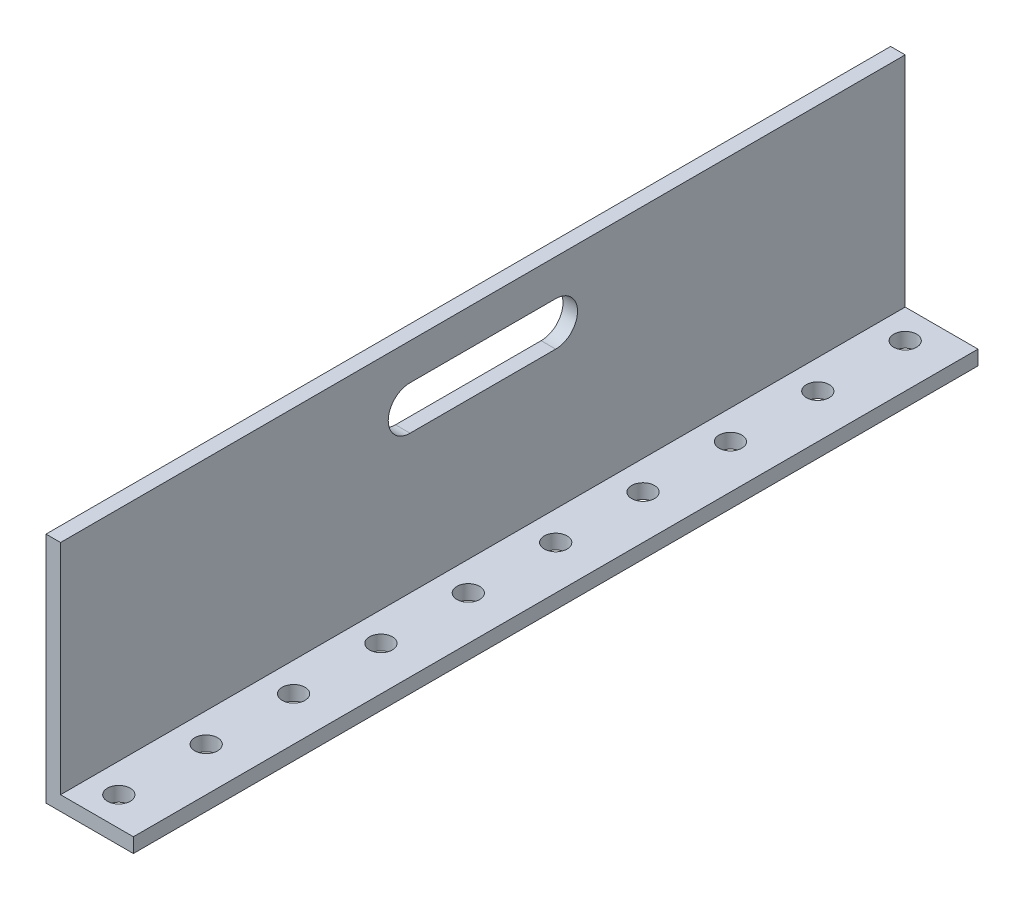
ISO-10303-21;
HEADER;
FILE_DESCRIPTION(('STEP AP214'),'2;1');
FILE_NAME('part.step','',(''),(''),'','','');
FILE_SCHEMA(('AUTOMOTIVE_DESIGN { 1 0 10303 214 1 1 1 1 }'));
ENDSEC;
DATA;
#1=APPLICATION_CONTEXT('core data for automotive mechanical design processes');
#2=APPLICATION_PROTOCOL_DEFINITION('international standard','automotive_design',2000,#1);
#3=PRODUCT_CONTEXT('',#1,'mechanical');
#4=PRODUCT('Part','Part','',(#3));
#5=PRODUCT_RELATED_PRODUCT_CATEGORY('part','',(#4));
#6=PRODUCT_DEFINITION_FORMATION('','',#4);
#7=PRODUCT_DEFINITION_CONTEXT('part definition',#1,'design');
#8=PRODUCT_DEFINITION('design','',#6,#7);
#9=PRODUCT_DEFINITION_SHAPE('','',#8);
#10=(LENGTH_UNIT() NAMED_UNIT(*) SI_UNIT(.MILLI.,.METRE.));
#11=(NAMED_UNIT(*) PLANE_ANGLE_UNIT() SI_UNIT($,.RADIAN.));
#12=(NAMED_UNIT(*) SI_UNIT($,.STERADIAN.) SOLID_ANGLE_UNIT());
#13=UNCERTAINTY_MEASURE_WITH_UNIT(LENGTH_MEASURE(1.E-05),#10,'distance_accuracy_value','');
#14=(GEOMETRIC_REPRESENTATION_CONTEXT(3) GLOBAL_UNCERTAINTY_ASSIGNED_CONTEXT((#13)) GLOBAL_UNIT_ASSIGNED_CONTEXT((#10,
#11,#12)) REPRESENTATION_CONTEXT('',''));
#15=CARTESIAN_POINT('',(0.,0.,0.));
#16=DIRECTION('',(0.,0.,1.));
#17=DIRECTION('',(1.,0.,0.));
#18=AXIS2_PLACEMENT_3D('',#15,#16,#17);
#19=CARTESIAN_POINT('',(0.,0.,184.15));
#20=DIRECTION('',(-1.,0.,0.));
#21=DIRECTION('',(0.,0.,1.));
#22=AXIS2_PLACEMENT_3D('',#19,#20,#21);
#23=PLANE('',#22);
#24=CARTESIAN_POINT('',(0.,38.1,76.2));
#25=DIRECTION('',(-1.,0.,0.));
#26=DIRECTION('',(0.,0.,1.));
#27=AXIS2_PLACEMENT_3D('',#24,#25,#26);
#28=CIRCLE('',#27,4.7625);
#29=CARTESIAN_POINT('',(0.,42.8625,76.2));
#30=VERTEX_POINT('',#29);
#31=CARTESIAN_POINT('',(0.,33.3375,76.2));
#32=VERTEX_POINT('',#31);
#33=EDGE_CURVE('E64',#30,#32,#28,.T.);
#34=ORIENTED_EDGE('',*,*,#33,.F.);
#35=DIRECTION('',(0.,0.,-1.));
#36=VECTOR('',#35,1.);
#37=CARTESIAN_POINT('',(0.,42.8625,76.2));
#38=LINE('',#37,#36);
#39=CARTESIAN_POINT('',(0.,42.8625,107.95));
#40=VERTEX_POINT('',#39);
#41=EDGE_CURVE('E146',#40,#30,#38,.T.);
#42=ORIENTED_EDGE('',*,*,#41,.F.);
#43=CARTESIAN_POINT('',(0.,38.1,107.95));
#44=DIRECTION('',(-1.,0.,0.));
#45=DIRECTION('',(0.,0.,1.));
#46=AXIS2_PLACEMENT_3D('',#43,#44,#45);
#47=CIRCLE('',#46,4.7625);
#48=CARTESIAN_POINT('',(0.,33.3375,107.95));
#49=VERTEX_POINT('',#48);
#50=EDGE_CURVE('E129',#49,#40,#47,.T.);
#51=ORIENTED_EDGE('',*,*,#50,.F.);
#52=DIRECTION('',(0.,0.,1.));
#53=VECTOR('',#52,1.);
#54=CARTESIAN_POINT('',(0.,33.3375,76.2));
#55=LINE('',#54,#53);
#56=EDGE_CURVE('E139',#32,#49,#55,.T.);
#57=ORIENTED_EDGE('',*,*,#56,.F.);
#58=EDGE_LOOP('',(#34,#42,#51,#57));
#59=FACE_BOUND('',#58,.T.);
#60=DIRECTION('',(0.,1.,0.));
#61=VECTOR('',#60,1.);
#62=CARTESIAN_POINT('',(0.,0.,0.));
#63=LINE('',#62,#61);
#64=CARTESIAN_POINT('',(0.,0.,0.));
#65=VERTEX_POINT('',#64);
#66=CARTESIAN_POINT('',(0.,50.8,0.));
#67=VERTEX_POINT('',#66);
#68=EDGE_CURVE('E242',#65,#67,#63,.T.);
#69=ORIENTED_EDGE('',*,*,#68,.F.);
#70=DIRECTION('',(0.,0.,-1.));
#71=VECTOR('',#70,1.);
#72=CARTESIAN_POINT('',(0.,0.,184.15));
#73=LINE('',#72,#71);
#74=CARTESIAN_POINT('',(0.,0.,184.15));
#75=VERTEX_POINT('',#74);
#76=EDGE_CURVE('E302',#75,#65,#73,.T.);
#77=ORIENTED_EDGE('',*,*,#76,.F.);
#78=DIRECTION('',(0.,1.,0.));
#79=VECTOR('',#78,1.);
#80=CARTESIAN_POINT('',(0.,0.,184.15));
#81=LINE('',#80,#79);
#82=CARTESIAN_POINT('',(0.,50.8,184.15));
#83=VERTEX_POINT('',#82);
#84=EDGE_CURVE('E243',#75,#83,#81,.T.);
#85=ORIENTED_EDGE('',*,*,#84,.T.);
#86=DIRECTION('',(0.,0.,-1.));
#87=VECTOR('',#86,1.);
#88=CARTESIAN_POINT('',(0.,50.8,184.15));
#89=LINE('',#88,#87);
#90=EDGE_CURVE('E265',#83,#67,#89,.T.);
#91=ORIENTED_EDGE('',*,*,#90,.T.);
#92=EDGE_LOOP('',(#69,#77,#85,#91));
#93=FACE_BOUND('',#92,.T.);
#94=ADVANCED_FACE('F49',(#59,#93),#23,.T.);
#95=CARTESIAN_POINT('',(0.,0.,184.15));
#96=DIRECTION('',(0.,1.,0.));
#97=DIRECTION('',(0.,0.,1.));
#98=AXIS2_PLACEMENT_3D('',#95,#96,#97);
#99=PLANE('',#98);
#100=CARTESIAN_POINT('',(9.525,0.,6.34999999999999));
#101=DIRECTION('',(0.,1.,0.));
#102=DIRECTION('',(0.,0.,1.));
#103=AXIS2_PLACEMENT_3D('',#100,#101,#102);
#104=CIRCLE('',#103,2.4892);
#105=CARTESIAN_POINT('',(9.525,0.,8.83919999999999));
#106=VERTEX_POINT('',#105);
#107=EDGE_CURVE('E238',#106,#106,#104,.T.);
#108=ORIENTED_EDGE('',*,*,#107,.T.);
#109=EDGE_LOOP('',(#108));
#110=FACE_BOUND('',#109,.T.);
#111=CARTESIAN_POINT('',(9.525,0.,25.4));
#112=DIRECTION('',(0.,1.,0.));
#113=DIRECTION('',(0.,0.,1.));
#114=AXIS2_PLACEMENT_3D('',#111,#112,#113);
#115=CIRCLE('',#114,2.4892);
#116=CARTESIAN_POINT('',(9.525,0.,27.8892));
#117=VERTEX_POINT('',#116);
#118=EDGE_CURVE('E234',#117,#117,#115,.T.);
#119=ORIENTED_EDGE('',*,*,#118,.T.);
#120=EDGE_LOOP('',(#119));
#121=FACE_BOUND('',#120,.T.);
#122=CARTESIAN_POINT('',(9.525,0.,44.45));
#123=DIRECTION('',(0.,1.,0.));
#124=DIRECTION('',(0.,0.,1.));
#125=AXIS2_PLACEMENT_3D('',#122,#123,#124);
#126=CIRCLE('',#125,2.4892);
#127=CARTESIAN_POINT('',(9.525,0.,46.9392));
#128=VERTEX_POINT('',#127);
#129=EDGE_CURVE('E230',#128,#128,#126,.T.);
#130=ORIENTED_EDGE('',*,*,#129,.T.);
#131=EDGE_LOOP('',(#130));
#132=FACE_BOUND('',#131,.T.);
#133=CARTESIAN_POINT('',(9.525,0.,63.5));
#134=DIRECTION('',(0.,1.,0.));
#135=DIRECTION('',(0.,0.,1.));
#136=AXIS2_PLACEMENT_3D('',#133,#134,#135);
#137=CIRCLE('',#136,2.4892);
#138=CARTESIAN_POINT('',(9.525,0.,65.9892));
#139=VERTEX_POINT('',#138);
#140=EDGE_CURVE('E226',#139,#139,#137,.T.);
#141=ORIENTED_EDGE('',*,*,#140,.T.);
#142=EDGE_LOOP('',(#141));
#143=FACE_BOUND('',#142,.T.);
#144=CARTESIAN_POINT('',(9.525,0.,82.55));
#145=DIRECTION('',(0.,1.,0.));
#146=DIRECTION('',(0.,0.,1.));
#147=AXIS2_PLACEMENT_3D('',#144,#145,#146);
#148=CIRCLE('',#147,2.4892);
#149=CARTESIAN_POINT('',(9.525,0.,85.0392));
#150=VERTEX_POINT('',#149);
#151=EDGE_CURVE('E222',#150,#150,#148,.T.);
#152=ORIENTED_EDGE('',*,*,#151,.T.);
#153=EDGE_LOOP('',(#152));
#154=FACE_BOUND('',#153,.T.);
#155=CARTESIAN_POINT('',(9.525,0.,101.6));
#156=DIRECTION('',(0.,1.,0.));
#157=DIRECTION('',(0.,0.,1.));
#158=AXIS2_PLACEMENT_3D('',#155,#156,#157);
#159=CIRCLE('',#158,2.4892);
#160=CARTESIAN_POINT('',(9.525,0.,104.0892));
#161=VERTEX_POINT('',#160);
#162=EDGE_CURVE('E218',#161,#161,#159,.T.);
#163=ORIENTED_EDGE('',*,*,#162,.T.);
#164=EDGE_LOOP('',(#163));
#165=FACE_BOUND('',#164,.T.);
#166=CARTESIAN_POINT('',(9.525,0.,120.65));
#167=DIRECTION('',(0.,1.,0.));
#168=DIRECTION('',(0.,0.,1.));
#169=AXIS2_PLACEMENT_3D('',#166,#167,#168);
#170=CIRCLE('',#169,2.4892);
#171=CARTESIAN_POINT('',(9.525,0.,123.1392));
#172=VERTEX_POINT('',#171);
#173=EDGE_CURVE('E214',#172,#172,#170,.T.);
#174=ORIENTED_EDGE('',*,*,#173,.T.);
#175=EDGE_LOOP('',(#174));
#176=FACE_BOUND('',#175,.T.);
#177=CARTESIAN_POINT('',(9.525,0.,139.7));
#178=DIRECTION('',(0.,1.,0.));
#179=DIRECTION('',(0.,0.,1.));
#180=AXIS2_PLACEMENT_3D('',#177,#178,#179);
#181=CIRCLE('',#180,2.4892);
#182=CARTESIAN_POINT('',(9.525,0.,142.1892));
#183=VERTEX_POINT('',#182);
#184=EDGE_CURVE('E210',#183,#183,#181,.T.);
#185=ORIENTED_EDGE('',*,*,#184,.T.);
#186=EDGE_LOOP('',(#185));
#187=FACE_BOUND('',#186,.T.);
#188=CARTESIAN_POINT('',(9.525,0.,158.75));
#189=DIRECTION('',(0.,1.,0.));
#190=DIRECTION('',(0.,0.,1.));
#191=AXIS2_PLACEMENT_3D('',#188,#189,#190);
#192=CIRCLE('',#191,2.4892);
#193=CARTESIAN_POINT('',(9.525,0.,161.2392));
#194=VERTEX_POINT('',#193);
#195=EDGE_CURVE('E206',#194,#194,#192,.T.);
#196=ORIENTED_EDGE('',*,*,#195,.T.);
#197=EDGE_LOOP('',(#196));
#198=FACE_BOUND('',#197,.T.);
#199=CARTESIAN_POINT('',(9.525,0.,177.8));
#200=DIRECTION('',(0.,1.,0.));
#201=DIRECTION('',(0.,0.,1.));
#202=AXIS2_PLACEMENT_3D('',#199,#200,#201);
#203=CIRCLE('',#202,2.4892);
#204=CARTESIAN_POINT('',(9.525,0.,180.2892));
#205=VERTEX_POINT('',#204);
#206=EDGE_CURVE('E167',#205,#205,#203,.T.);
#207=ORIENTED_EDGE('',*,*,#206,.T.);
#208=EDGE_LOOP('',(#207));
#209=FACE_BOUND('',#208,.T.);
#210=DIRECTION('',(1.,0.,0.));
#211=VECTOR('',#210,1.);
#212=CARTESIAN_POINT('',(0.,0.,0.));
#213=LINE('',#212,#211);
#214=CARTESIAN_POINT('',(19.05,0.,0.));
#215=VERTEX_POINT('',#214);
#216=EDGE_CURVE('E269',#65,#215,#213,.T.);
#217=ORIENTED_EDGE('',*,*,#216,.T.);
#218=DIRECTION('',(0.,0.,-1.));
#219=VECTOR('',#218,1.);
#220=CARTESIAN_POINT('',(19.05,0.,184.15));
#221=LINE('',#220,#219);
#222=CARTESIAN_POINT('',(19.05,0.,184.15));
#223=VERTEX_POINT('',#222);
#224=EDGE_CURVE('E298',#223,#215,#221,.T.);
#225=ORIENTED_EDGE('',*,*,#224,.F.);
#226=DIRECTION('',(1.,0.,0.));
#227=VECTOR('',#226,1.);
#228=CARTESIAN_POINT('',(0.,0.,184.15));
#229=LINE('',#228,#227);
#230=EDGE_CURVE('E247',#75,#223,#229,.T.);
#231=ORIENTED_EDGE('',*,*,#230,.F.);
#232=ORIENTED_EDGE('',*,*,#76,.T.);
#233=EDGE_LOOP('',(#217,#225,#231,#232));
#234=FACE_BOUND('',#233,.T.);
#235=ADVANCED_FACE('F334',(#110,#121,#132,#143,#154,#165,#176,#187,#198,#209,#234),#99,.F.);
#236=CARTESIAN_POINT('',(19.05,0.,184.15));
#237=DIRECTION('',(-1.,0.,0.));
#238=DIRECTION('',(0.,0.,1.));
#239=AXIS2_PLACEMENT_3D('',#236,#237,#238);
#240=PLANE('',#239);
#241=DIRECTION('',(0.,1.,0.));
#242=VECTOR('',#241,1.);
#243=CARTESIAN_POINT('',(19.05,0.,0.));
#244=LINE('',#243,#242);
#245=CARTESIAN_POINT('',(19.05,3.175,0.));
#246=VERTEX_POINT('',#245);
#247=EDGE_CURVE('E272',#215,#246,#244,.T.);
#248=ORIENTED_EDGE('',*,*,#247,.T.);
#249=DIRECTION('',(0.,0.,-1.));
#250=VECTOR('',#249,1.);
#251=CARTESIAN_POINT('',(19.05,3.175,184.15));
#252=LINE('',#251,#250);
#253=CARTESIAN_POINT('',(19.05,3.175,184.15));
#254=VERTEX_POINT('',#253);
#255=EDGE_CURVE('E295',#254,#246,#252,.T.);
#256=ORIENTED_EDGE('',*,*,#255,.F.);
#257=DIRECTION('',(0.,1.,0.));
#258=VECTOR('',#257,1.);
#259=CARTESIAN_POINT('',(19.05,0.,184.15));
#260=LINE('',#259,#258);
#261=EDGE_CURVE('E251',#223,#254,#260,.T.);
#262=ORIENTED_EDGE('',*,*,#261,.F.);
#263=ORIENTED_EDGE('',*,*,#224,.T.);
#264=EDGE_LOOP('',(#248,#256,#262,#263));
#265=FACE_BOUND('',#264,.T.);
#266=ADVANCED_FACE('F338',(#265),#240,.F.);
#267=CARTESIAN_POINT('',(0.,3.175,184.15));
#268=DIRECTION('',(0.,1.,0.));
#269=DIRECTION('',(0.,0.,1.));
#270=AXIS2_PLACEMENT_3D('',#267,#268,#269);
#271=PLANE('',#270);
#272=CARTESIAN_POINT('',(9.525,3.175,6.34999999999999));
#273=DIRECTION('',(0.,1.,0.));
#274=DIRECTION('',(0.,0.,1.));
#275=AXIS2_PLACEMENT_3D('',#272,#273,#274);
#276=CIRCLE('',#275,2.4892);
#277=CARTESIAN_POINT('',(9.525,3.175,8.83919999999999));
#278=VERTEX_POINT('',#277);
#279=EDGE_CURVE('E163',#278,#278,#276,.T.);
#280=ORIENTED_EDGE('',*,*,#279,.F.);
#281=EDGE_LOOP('',(#280));
#282=FACE_BOUND('',#281,.T.);
#283=CARTESIAN_POINT('',(9.525,3.175,25.4));
#284=DIRECTION('',(0.,1.,0.));
#285=DIRECTION('',(0.,0.,1.));
#286=AXIS2_PLACEMENT_3D('',#283,#284,#285);
#287=CIRCLE('',#286,2.4892);
#288=CARTESIAN_POINT('',(9.525,3.175,27.8892));
#289=VERTEX_POINT('',#288);
#290=EDGE_CURVE('E168',#289,#289,#287,.T.);
#291=ORIENTED_EDGE('',*,*,#290,.F.);
#292=EDGE_LOOP('',(#291));
#293=FACE_BOUND('',#292,.T.);
#294=CARTESIAN_POINT('',(9.525,3.175,44.45));
#295=DIRECTION('',(0.,1.,0.));
#296=DIRECTION('',(0.,0.,1.));
#297=AXIS2_PLACEMENT_3D('',#294,#295,#296);
#298=CIRCLE('',#297,2.4892);
#299=CARTESIAN_POINT('',(9.525,3.175,46.9392));
#300=VERTEX_POINT('',#299);
#301=EDGE_CURVE('E172',#300,#300,#298,.T.);
#302=ORIENTED_EDGE('',*,*,#301,.F.);
#303=EDGE_LOOP('',(#302));
#304=FACE_BOUND('',#303,.T.);
#305=CARTESIAN_POINT('',(9.525,3.175,63.5));
#306=DIRECTION('',(0.,1.,0.));
#307=DIRECTION('',(0.,0.,1.));
#308=AXIS2_PLACEMENT_3D('',#305,#306,#307);
#309=CIRCLE('',#308,2.4892);
#310=CARTESIAN_POINT('',(9.525,3.175,65.9892));
#311=VERTEX_POINT('',#310);
#312=EDGE_CURVE('E176',#311,#311,#309,.T.);
#313=ORIENTED_EDGE('',*,*,#312,.F.);
#314=EDGE_LOOP('',(#313));
#315=FACE_BOUND('',#314,.T.);
#316=CARTESIAN_POINT('',(9.525,3.175,82.55));
#317=DIRECTION('',(0.,1.,0.));
#318=DIRECTION('',(0.,0.,1.));
#319=AXIS2_PLACEMENT_3D('',#316,#317,#318);
#320=CIRCLE('',#319,2.4892);
#321=CARTESIAN_POINT('',(9.525,3.175,85.0392));
#322=VERTEX_POINT('',#321);
#323=EDGE_CURVE('E180',#322,#322,#320,.T.);
#324=ORIENTED_EDGE('',*,*,#323,.F.);
#325=EDGE_LOOP('',(#324));
#326=FACE_BOUND('',#325,.T.);
#327=CARTESIAN_POINT('',(9.525,3.175,101.6));
#328=DIRECTION('',(0.,1.,0.));
#329=DIRECTION('',(0.,0.,1.));
#330=AXIS2_PLACEMENT_3D('',#327,#328,#329);
#331=CIRCLE('',#330,2.4892);
#332=CARTESIAN_POINT('',(9.525,3.175,104.0892));
#333=VERTEX_POINT('',#332);
#334=EDGE_CURVE('E184',#333,#333,#331,.T.);
#335=ORIENTED_EDGE('',*,*,#334,.F.);
#336=EDGE_LOOP('',(#335));
#337=FACE_BOUND('',#336,.T.);
#338=CARTESIAN_POINT('',(9.525,3.175,120.65));
#339=DIRECTION('',(0.,1.,0.));
#340=DIRECTION('',(0.,0.,1.));
#341=AXIS2_PLACEMENT_3D('',#338,#339,#340);
#342=CIRCLE('',#341,2.4892);
#343=CARTESIAN_POINT('',(9.525,3.175,123.1392));
#344=VERTEX_POINT('',#343);
#345=EDGE_CURVE('E188',#344,#344,#342,.T.);
#346=ORIENTED_EDGE('',*,*,#345,.F.);
#347=EDGE_LOOP('',(#346));
#348=FACE_BOUND('',#347,.T.);
#349=CARTESIAN_POINT('',(9.525,3.175,139.7));
#350=DIRECTION('',(0.,1.,0.));
#351=DIRECTION('',(0.,0.,1.));
#352=AXIS2_PLACEMENT_3D('',#349,#350,#351);
#353=CIRCLE('',#352,2.4892);
#354=CARTESIAN_POINT('',(9.525,3.175,142.1892));
#355=VERTEX_POINT('',#354);
#356=EDGE_CURVE('E192',#355,#355,#353,.T.);
#357=ORIENTED_EDGE('',*,*,#356,.F.);
#358=EDGE_LOOP('',(#357));
#359=FACE_BOUND('',#358,.T.);
#360=CARTESIAN_POINT('',(9.525,3.175,158.75));
#361=DIRECTION('',(0.,1.,0.));
#362=DIRECTION('',(0.,0.,1.));
#363=AXIS2_PLACEMENT_3D('',#360,#361,#362);
#364=CIRCLE('',#363,2.4892);
#365=CARTESIAN_POINT('',(9.525,3.175,161.2392));
#366=VERTEX_POINT('',#365);
#367=EDGE_CURVE('E196',#366,#366,#364,.T.);
#368=ORIENTED_EDGE('',*,*,#367,.F.);
#369=EDGE_LOOP('',(#368));
#370=FACE_BOUND('',#369,.T.);
#371=CARTESIAN_POINT('',(9.525,3.175,177.8));
#372=DIRECTION('',(0.,1.,0.));
#373=DIRECTION('',(0.,0.,1.));
#374=AXIS2_PLACEMENT_3D('',#371,#372,#373);
#375=CIRCLE('',#374,2.4892);
#376=CARTESIAN_POINT('',(9.525,3.175,180.2892));
#377=VERTEX_POINT('',#376);
#378=EDGE_CURVE('E158',#377,#377,#375,.T.);
#379=ORIENTED_EDGE('',*,*,#378,.F.);
#380=EDGE_LOOP('',(#379));
#381=FACE_BOUND('',#380,.T.);
#382=DIRECTION('',(1.,0.,0.));
#383=VECTOR('',#382,1.);
#384=CARTESIAN_POINT('',(0.,3.175,0.));
#385=LINE('',#384,#383);
#386=CARTESIAN_POINT('',(3.175,3.175,0.));
#387=VERTEX_POINT('',#386);
#388=EDGE_CURVE('E276',#387,#246,#385,.T.);
#389=ORIENTED_EDGE('',*,*,#388,.F.);
#390=DIRECTION('',(0.,0.,-1.));
#391=VECTOR('',#390,1.);
#392=CARTESIAN_POINT('',(3.175,3.175,184.15));
#393=LINE('',#392,#391);
#394=CARTESIAN_POINT('',(3.175,3.175,184.15));
#395=VERTEX_POINT('',#394);
#396=EDGE_CURVE('E292',#395,#387,#393,.T.);
#397=ORIENTED_EDGE('',*,*,#396,.F.);
#398=DIRECTION('',(1.,0.,0.));
#399=VECTOR('',#398,1.);
#400=CARTESIAN_POINT('',(0.,3.175,184.15));
#401=LINE('',#400,#399);
#402=EDGE_CURVE('E254',#395,#254,#401,.T.);
#403=ORIENTED_EDGE('',*,*,#402,.T.);
#404=ORIENTED_EDGE('',*,*,#255,.T.);
#405=EDGE_LOOP('',(#389,#397,#403,#404));
#406=FACE_BOUND('',#405,.T.);
#407=ADVANCED_FACE('F345',(#282,#293,#304,#315,#326,#337,#348,#359,#370,#381,#406),#271,.T.);
#408=CARTESIAN_POINT('',(3.175,0.,184.15));
#409=DIRECTION('',(-1.,0.,0.));
#410=DIRECTION('',(0.,0.,1.));
#411=AXIS2_PLACEMENT_3D('',#408,#409,#410);
#412=PLANE('',#411);
#413=DIRECTION('',(0.,0.,-1.));
#414=VECTOR('',#413,1.);
#415=CARTESIAN_POINT('',(3.175,42.8625,184.15));
#416=LINE('',#415,#414);
#417=CARTESIAN_POINT('',(3.17500000000001,42.8625,107.95));
#418=VERTEX_POINT('',#417);
#419=CARTESIAN_POINT('',(3.17500000000001,42.8625,76.2));
#420=VERTEX_POINT('',#419);
#421=EDGE_CURVE('E57',#418,#420,#416,.T.);
#422=ORIENTED_EDGE('',*,*,#421,.T.);
#423=CARTESIAN_POINT('',(3.17500000000001,38.1,76.2));
#424=DIRECTION('',(-1.,0.,0.));
#425=DIRECTION('',(0.,0.,1.));
#426=AXIS2_PLACEMENT_3D('',#423,#424,#425);
#427=CIRCLE('',#426,4.7625);
#428=CARTESIAN_POINT('',(3.17500000000001,33.3375,76.2));
#429=VERTEX_POINT('',#428);
#430=EDGE_CURVE('E11',#420,#429,#427,.T.);
#431=ORIENTED_EDGE('',*,*,#430,.T.);
#432=DIRECTION('',(0.,0.,1.));
#433=VECTOR('',#432,1.);
#434=CARTESIAN_POINT('',(3.175,33.3375,184.15));
#435=LINE('',#434,#433);
#436=CARTESIAN_POINT('',(3.175,33.3375,107.95));
#437=VERTEX_POINT('',#436);
#438=EDGE_CURVE('E305',#429,#437,#435,.T.);
#439=ORIENTED_EDGE('',*,*,#438,.T.);
#440=CARTESIAN_POINT('',(3.17500000000001,38.1,107.95));
#441=DIRECTION('',(-1.,0.,0.));
#442=DIRECTION('',(0.,0.,1.));
#443=AXIS2_PLACEMENT_3D('',#440,#441,#442);
#444=CIRCLE('',#443,4.7625);
#445=EDGE_CURVE('E132',#437,#418,#444,.T.);
#446=ORIENTED_EDGE('',*,*,#445,.T.);
#447=EDGE_LOOP('',(#422,#431,#439,#446));
#448=FACE_BOUND('',#447,.T.);
#449=DIRECTION('',(0.,1.,0.));
#450=VECTOR('',#449,1.);
#451=CARTESIAN_POINT('',(3.175,0.,0.));
#452=LINE('',#451,#450);
#453=CARTESIAN_POINT('',(3.175,50.8,0.));
#454=VERTEX_POINT('',#453);
#455=EDGE_CURVE('E280',#387,#454,#452,.T.);
#456=ORIENTED_EDGE('',*,*,#455,.T.);
#457=DIRECTION('',(0.,0.,-1.));
#458=VECTOR('',#457,1.);
#459=CARTESIAN_POINT('',(3.175,50.8,184.15));
#460=LINE('',#459,#458);
#461=CARTESIAN_POINT('',(3.175,50.8,184.15));
#462=VERTEX_POINT('',#461);
#463=EDGE_CURVE('E289',#462,#454,#460,.T.);
#464=ORIENTED_EDGE('',*,*,#463,.F.);
#465=DIRECTION('',(0.,1.,0.));
#466=VECTOR('',#465,1.);
#467=CARTESIAN_POINT('',(3.175,0.,184.15));
#468=LINE('',#467,#466);
#469=EDGE_CURVE('E258',#395,#462,#468,.T.);
#470=ORIENTED_EDGE('',*,*,#469,.F.);
#471=ORIENTED_EDGE('',*,*,#396,.T.);
#472=EDGE_LOOP('',(#456,#464,#470,#471));
#473=FACE_BOUND('',#472,.T.);
#474=ADVANCED_FACE('F314',(#448,#473),#412,.F.);
#475=CARTESIAN_POINT('',(0.,50.8,184.15));
#476=DIRECTION('',(0.,1.,0.));
#477=DIRECTION('',(0.,0.,1.));
#478=AXIS2_PLACEMENT_3D('',#475,#476,#477);
#479=PLANE('',#478);
#480=DIRECTION('',(1.,0.,0.));
#481=VECTOR('',#480,1.);
#482=CARTESIAN_POINT('',(0.,50.8,0.));
#483=LINE('',#482,#481);
#484=EDGE_CURVE('E248',#67,#454,#483,.T.);
#485=ORIENTED_EDGE('',*,*,#484,.F.);
#486=ORIENTED_EDGE('',*,*,#90,.F.);
#487=DIRECTION('',(1.,0.,0.));
#488=VECTOR('',#487,1.);
#489=CARTESIAN_POINT('',(0.,50.8,184.15));
#490=LINE('',#489,#488);
#491=EDGE_CURVE('E261',#83,#462,#490,.T.);
#492=ORIENTED_EDGE('',*,*,#491,.T.);
#493=ORIENTED_EDGE('',*,*,#463,.T.);
#494=EDGE_LOOP('',(#485,#486,#492,#493));
#495=FACE_BOUND('',#494,.T.);
#496=ADVANCED_FACE('F353',(#495),#479,.T.);
#497=CARTESIAN_POINT('',(0.,0.,184.15));
#498=DIRECTION('',(0.,0.,1.));
#499=DIRECTION('',(1.,0.,0.));
#500=AXIS2_PLACEMENT_3D('',#497,#498,#499);
#501=PLANE('',#500);
#502=ORIENTED_EDGE('',*,*,#84,.F.);
#503=ORIENTED_EDGE('',*,*,#230,.T.);
#504=ORIENTED_EDGE('',*,*,#261,.T.);
#505=ORIENTED_EDGE('',*,*,#402,.F.);
#506=ORIENTED_EDGE('',*,*,#469,.T.);
#507=ORIENTED_EDGE('',*,*,#491,.F.);
#508=EDGE_LOOP('',(#502,#503,#504,#505,#506,#507));
#509=FACE_BOUND('',#508,.T.);
#510=ADVANCED_FACE('F356',(#509),#501,.T.);
#511=CARTESIAN_POINT('',(0.,0.,0.));
#512=DIRECTION('',(0.,0.,1.));
#513=DIRECTION('',(1.,0.,0.));
#514=AXIS2_PLACEMENT_3D('',#511,#512,#513);
#515=PLANE('',#514);
#516=ORIENTED_EDGE('',*,*,#68,.T.);
#517=ORIENTED_EDGE('',*,*,#484,.T.);
#518=ORIENTED_EDGE('',*,*,#455,.F.);
#519=ORIENTED_EDGE('',*,*,#388,.T.);
#520=ORIENTED_EDGE('',*,*,#247,.F.);
#521=ORIENTED_EDGE('',*,*,#216,.F.);
#522=EDGE_LOOP('',(#516,#517,#518,#519,#520,#521));
#523=FACE_BOUND('',#522,.T.);
#524=ADVANCED_FACE('F358',(#523),#515,.F.);
#525=CARTESIAN_POINT('',(9.525,-180.975,177.8));
#526=DIRECTION('',(0.,1.,0.));
#527=DIRECTION('',(0.,0.,1.));
#528=AXIS2_PLACEMENT_3D('',#525,#526,#527);
#529=CYLINDRICAL_SURFACE('',#528,2.4892);
#530=ORIENTED_EDGE('',*,*,#378,.T.);
#531=EDGE_LOOP('',(#530));
#532=FACE_BOUND('',#531,.T.);
#533=ORIENTED_EDGE('',*,*,#206,.F.);
#534=EDGE_LOOP('',(#533));
#535=FACE_BOUND('',#534,.T.);
#536=ADVANCED_FACE('F360',(#532,#535),#529,.F.);
#537=CARTESIAN_POINT('',(9.525,-180.975,158.75));
#538=DIRECTION('',(0.,1.,0.));
#539=DIRECTION('',(0.,0.,1.));
#540=AXIS2_PLACEMENT_3D('',#537,#538,#539);
#541=CYLINDRICAL_SURFACE('',#540,2.4892);
#542=ORIENTED_EDGE('',*,*,#367,.T.);
#543=EDGE_LOOP('',(#542));
#544=FACE_BOUND('',#543,.T.);
#545=ORIENTED_EDGE('',*,*,#195,.F.);
#546=EDGE_LOOP('',(#545));
#547=FACE_BOUND('',#546,.T.);
#548=ADVANCED_FACE('F367',(#544,#547),#541,.F.);
#549=CARTESIAN_POINT('',(9.525,-180.975,139.7));
#550=DIRECTION('',(0.,1.,0.));
#551=DIRECTION('',(0.,0.,1.));
#552=AXIS2_PLACEMENT_3D('',#549,#550,#551);
#553=CYLINDRICAL_SURFACE('',#552,2.4892);
#554=ORIENTED_EDGE('',*,*,#356,.T.);
#555=EDGE_LOOP('',(#554));
#556=FACE_BOUND('',#555,.T.);
#557=ORIENTED_EDGE('',*,*,#184,.F.);
#558=EDGE_LOOP('',(#557));
#559=FACE_BOUND('',#558,.T.);
#560=ADVANCED_FACE('F371',(#556,#559),#553,.F.);
#561=CARTESIAN_POINT('',(9.525,-180.975,120.65));
#562=DIRECTION('',(0.,1.,0.));
#563=DIRECTION('',(0.,0.,1.));
#564=AXIS2_PLACEMENT_3D('',#561,#562,#563);
#565=CYLINDRICAL_SURFACE('',#564,2.4892);
#566=ORIENTED_EDGE('',*,*,#345,.T.);
#567=EDGE_LOOP('',(#566));
#568=FACE_BOUND('',#567,.T.);
#569=ORIENTED_EDGE('',*,*,#173,.F.);
#570=EDGE_LOOP('',(#569));
#571=FACE_BOUND('',#570,.T.);
#572=ADVANCED_FACE('F375',(#568,#571),#565,.F.);
#573=CARTESIAN_POINT('',(9.525,-180.975,101.6));
#574=DIRECTION('',(0.,1.,0.));
#575=DIRECTION('',(0.,0.,1.));
#576=AXIS2_PLACEMENT_3D('',#573,#574,#575);
#577=CYLINDRICAL_SURFACE('',#576,2.4892);
#578=ORIENTED_EDGE('',*,*,#334,.T.);
#579=EDGE_LOOP('',(#578));
#580=FACE_BOUND('',#579,.T.);
#581=ORIENTED_EDGE('',*,*,#162,.F.);
#582=EDGE_LOOP('',(#581));
#583=FACE_BOUND('',#582,.T.);
#584=ADVANCED_FACE('F379',(#580,#583),#577,.F.);
#585=CARTESIAN_POINT('',(9.525,-180.975,82.55));
#586=DIRECTION('',(0.,1.,0.));
#587=DIRECTION('',(0.,0.,1.));
#588=AXIS2_PLACEMENT_3D('',#585,#586,#587);
#589=CYLINDRICAL_SURFACE('',#588,2.4892);
#590=ORIENTED_EDGE('',*,*,#323,.T.);
#591=EDGE_LOOP('',(#590));
#592=FACE_BOUND('',#591,.T.);
#593=ORIENTED_EDGE('',*,*,#151,.F.);
#594=EDGE_LOOP('',(#593));
#595=FACE_BOUND('',#594,.T.);
#596=ADVANCED_FACE('F383',(#592,#595),#589,.F.);
#597=CARTESIAN_POINT('',(9.525,-180.975,63.5));
#598=DIRECTION('',(0.,1.,0.));
#599=DIRECTION('',(0.,0.,1.));
#600=AXIS2_PLACEMENT_3D('',#597,#598,#599);
#601=CYLINDRICAL_SURFACE('',#600,2.4892);
#602=ORIENTED_EDGE('',*,*,#312,.T.);
#603=EDGE_LOOP('',(#602));
#604=FACE_BOUND('',#603,.T.);
#605=ORIENTED_EDGE('',*,*,#140,.F.);
#606=EDGE_LOOP('',(#605));
#607=FACE_BOUND('',#606,.T.);
#608=ADVANCED_FACE('F387',(#604,#607),#601,.F.);
#609=CARTESIAN_POINT('',(9.525,-180.975,44.45));
#610=DIRECTION('',(0.,1.,0.));
#611=DIRECTION('',(0.,0.,1.));
#612=AXIS2_PLACEMENT_3D('',#609,#610,#611);
#613=CYLINDRICAL_SURFACE('',#612,2.4892);
#614=ORIENTED_EDGE('',*,*,#301,.T.);
#615=EDGE_LOOP('',(#614));
#616=FACE_BOUND('',#615,.T.);
#617=ORIENTED_EDGE('',*,*,#129,.F.);
#618=EDGE_LOOP('',(#617));
#619=FACE_BOUND('',#618,.T.);
#620=ADVANCED_FACE('F391',(#616,#619),#613,.F.);
#621=CARTESIAN_POINT('',(9.525,-180.975,25.4));
#622=DIRECTION('',(0.,1.,0.));
#623=DIRECTION('',(0.,0.,1.));
#624=AXIS2_PLACEMENT_3D('',#621,#622,#623);
#625=CYLINDRICAL_SURFACE('',#624,2.4892);
#626=ORIENTED_EDGE('',*,*,#290,.T.);
#627=EDGE_LOOP('',(#626));
#628=FACE_BOUND('',#627,.T.);
#629=ORIENTED_EDGE('',*,*,#118,.F.);
#630=EDGE_LOOP('',(#629));
#631=FACE_BOUND('',#630,.T.);
#632=ADVANCED_FACE('F329',(#628,#631),#625,.F.);
#633=CARTESIAN_POINT('',(9.525,-180.975,6.34999999999999));
#634=DIRECTION('',(0.,1.,0.));
#635=DIRECTION('',(0.,0.,1.));
#636=AXIS2_PLACEMENT_3D('',#633,#634,#635);
#637=CYLINDRICAL_SURFACE('',#636,2.4892);
#638=ORIENTED_EDGE('',*,*,#279,.T.);
#639=EDGE_LOOP('',(#638));
#640=FACE_BOUND('',#639,.T.);
#641=ORIENTED_EDGE('',*,*,#107,.F.);
#642=EDGE_LOOP('',(#641));
#643=FACE_BOUND('',#642,.T.);
#644=ADVANCED_FACE('F321',(#640,#643),#637,.F.);
#645=CARTESIAN_POINT('',(165.1,38.1,76.2));
#646=DIRECTION('',(-1.,0.,0.));
#647=DIRECTION('',(0.,0.,1.));
#648=AXIS2_PLACEMENT_3D('',#645,#646,#647);
#649=CYLINDRICAL_SURFACE('',#648,4.7625);
#650=DIRECTION('',(-1.,0.,0.));
#651=VECTOR('',#650,1.);
#652=CARTESIAN_POINT('',(165.1,42.8625,76.2));
#653=LINE('',#652,#651);
#654=EDGE_CURVE('E155',#420,#30,#653,.T.);
#655=ORIENTED_EDGE('',*,*,#654,.T.);
#656=ORIENTED_EDGE('',*,*,#33,.T.);
#657=DIRECTION('',(-1.,0.,0.));
#658=VECTOR('',#657,1.);
#659=CARTESIAN_POINT('',(165.1,33.3375,76.2));
#660=LINE('',#659,#658);
#661=EDGE_CURVE('E136',#429,#32,#660,.T.);
#662=ORIENTED_EDGE('',*,*,#661,.F.);
#663=ORIENTED_EDGE('',*,*,#430,.F.);
#664=EDGE_LOOP('',(#655,#656,#662,#663));
#665=FACE_BOUND('',#664,.T.);
#666=ADVANCED_FACE('F319',(#665),#649,.F.);
#667=CARTESIAN_POINT('',(165.1,42.8625,76.2));
#668=DIRECTION('',(0.,1.,0.));
#669=DIRECTION('',(0.,0.,1.));
#670=AXIS2_PLACEMENT_3D('',#667,#668,#669);
#671=PLANE('',#670);
#672=DIRECTION('',(-1.,0.,0.));
#673=VECTOR('',#672,1.);
#674=CARTESIAN_POINT('',(165.1,42.8625,107.95));
#675=LINE('',#674,#673);
#676=EDGE_CURVE('E135',#418,#40,#675,.T.);
#677=ORIENTED_EDGE('',*,*,#676,.T.);
#678=ORIENTED_EDGE('',*,*,#41,.T.);
#679=ORIENTED_EDGE('',*,*,#654,.F.);
#680=ORIENTED_EDGE('',*,*,#421,.F.);
#681=EDGE_LOOP('',(#677,#678,#679,#680));
#682=FACE_BOUND('',#681,.T.);
#683=ADVANCED_FACE('F318',(#682),#671,.F.);
#684=CARTESIAN_POINT('',(165.1,38.1,107.95));
#685=DIRECTION('',(-1.,0.,0.));
#686=DIRECTION('',(0.,0.,1.));
#687=AXIS2_PLACEMENT_3D('',#684,#685,#686);
#688=CYLINDRICAL_SURFACE('',#687,4.7625);
#689=DIRECTION('',(-1.,0.,0.));
#690=VECTOR('',#689,1.);
#691=CARTESIAN_POINT('',(165.1,33.3375,107.95));
#692=LINE('',#691,#690);
#693=EDGE_CURVE('E72',#437,#49,#692,.T.);
#694=ORIENTED_EDGE('',*,*,#693,.T.);
#695=ORIENTED_EDGE('',*,*,#50,.T.);
#696=ORIENTED_EDGE('',*,*,#676,.F.);
#697=ORIENTED_EDGE('',*,*,#445,.F.);
#698=EDGE_LOOP('',(#694,#695,#696,#697));
#699=FACE_BOUND('',#698,.T.);
#700=ADVANCED_FACE('F126',(#699),#688,.F.);
#701=CARTESIAN_POINT('',(165.1,33.3375,76.2));
#702=DIRECTION('',(0.,-1.,0.));
#703=DIRECTION('',(0.,0.,-1.));
#704=AXIS2_PLACEMENT_3D('',#701,#702,#703);
#705=PLANE('',#704);
#706=ORIENTED_EDGE('',*,*,#661,.T.);
#707=ORIENTED_EDGE('',*,*,#56,.T.);
#708=ORIENTED_EDGE('',*,*,#693,.F.);
#709=ORIENTED_EDGE('',*,*,#438,.F.);
#710=EDGE_LOOP('',(#706,#707,#708,#709));
#711=FACE_BOUND('',#710,.T.);
#712=ADVANCED_FACE('F140',(#711),#705,.F.);
#713=CLOSED_SHELL('',(#94,#235,#266,#407,#474,#496,#510,#524,#536,#548,#560,#572,#584,#596,#608,
#620,#632,#644,#666,#683,#700,#712));
#714=MANIFOLD_SOLID_BREP('B2',#713);
#715=ADVANCED_BREP_SHAPE_REPRESENTATION('',(#18,#714),#14);
#716=SHAPE_DEFINITION_REPRESENTATION(#9,#715);
ENDSEC;
END-ISO-10303-21;
